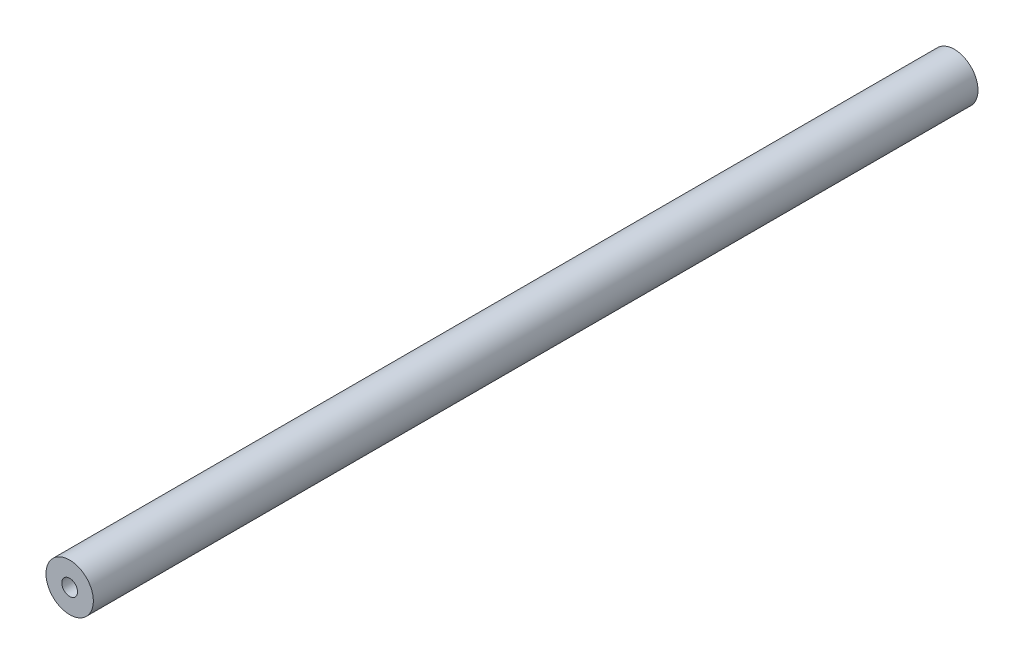
ISO-10303-21;
HEADER;
FILE_DESCRIPTION(('STEP AP214'),'2;1');
FILE_NAME('part.step','',(''),(''),'','','');
FILE_SCHEMA(('AUTOMOTIVE_DESIGN { 1 0 10303 214 1 1 1 1 }'));
ENDSEC;
DATA;
#1=APPLICATION_CONTEXT('core data for automotive mechanical design processes');
#2=APPLICATION_PROTOCOL_DEFINITION('international standard','automotive_design',2000,#1);
#3=PRODUCT_CONTEXT('',#1,'mechanical');
#4=PRODUCT('Part','Part','',(#3));
#5=PRODUCT_RELATED_PRODUCT_CATEGORY('part','',(#4));
#6=PRODUCT_DEFINITION_FORMATION('','',#4);
#7=PRODUCT_DEFINITION_CONTEXT('part definition',#1,'design');
#8=PRODUCT_DEFINITION('design','',#6,#7);
#9=PRODUCT_DEFINITION_SHAPE('','',#8);
#10=(LENGTH_UNIT() NAMED_UNIT(*) SI_UNIT(.MILLI.,.METRE.));
#11=(NAMED_UNIT(*) PLANE_ANGLE_UNIT() SI_UNIT($,.RADIAN.));
#12=(NAMED_UNIT(*) SI_UNIT($,.STERADIAN.) SOLID_ANGLE_UNIT());
#13=UNCERTAINTY_MEASURE_WITH_UNIT(LENGTH_MEASURE(1.E-05),#10,'distance_accuracy_value','');
#14=(GEOMETRIC_REPRESENTATION_CONTEXT(3) GLOBAL_UNCERTAINTY_ASSIGNED_CONTEXT((#13)) GLOBAL_UNIT_ASSIGNED_CONTEXT((#10,
#11,#12)) REPRESENTATION_CONTEXT('',''));
#15=CARTESIAN_POINT('',(0.,0.,0.));
#16=DIRECTION('',(0.,0.,1.));
#17=DIRECTION('',(1.,0.,0.));
#18=AXIS2_PLACEMENT_3D('',#15,#16,#17);
#19=CARTESIAN_POINT('',(0.,0.,140.));
#20=DIRECTION('',(0.,0.,-1.));
#21=DIRECTION('',(-1.,0.,0.));
#22=AXIS2_PLACEMENT_3D('',#19,#20,#21);
#23=CYLINDRICAL_SURFACE('',#22,7.5);
#24=CARTESIAN_POINT('',(0.,0.,140.));
#25=DIRECTION('',(0.,0.,1.));
#26=DIRECTION('',(1.,0.,0.));
#27=AXIS2_PLACEMENT_3D('',#24,#25,#26);
#28=CIRCLE('',#27,7.5);
#29=CARTESIAN_POINT('',(7.5,0.,140.));
#30=VERTEX_POINT('',#29);
#31=EDGE_CURVE('E11',#30,#30,#28,.T.);
#32=ORIENTED_EDGE('',*,*,#31,.F.);
#33=EDGE_LOOP('',(#32));
#34=FACE_BOUND('',#33,.T.);
#35=CARTESIAN_POINT('',(0.,0.,-140.));
#36=DIRECTION('',(0.,0.,1.));
#37=DIRECTION('',(1.,0.,0.));
#38=AXIS2_PLACEMENT_3D('',#35,#36,#37);
#39=CIRCLE('',#38,7.5);
#40=CARTESIAN_POINT('',(7.5,0.,-140.));
#41=VERTEX_POINT('',#40);
#42=EDGE_CURVE('E19',#41,#41,#39,.T.);
#43=ORIENTED_EDGE('',*,*,#42,.T.);
#44=EDGE_LOOP('',(#43));
#45=FACE_BOUND('',#44,.T.);
#46=ADVANCED_FACE('F16',(#34,#45),#23,.T.);
#47=CARTESIAN_POINT('',(0.,0.,140.));
#48=DIRECTION('',(0.,0.,1.));
#49=DIRECTION('',(1.,0.,0.));
#50=AXIS2_PLACEMENT_3D('',#47,#48,#49);
#51=PLANE('',#50);
#52=CARTESIAN_POINT('',(0.,0.,140.));
#53=DIRECTION('',(0.,0.,1.));
#54=DIRECTION('',(1.,0.,0.));
#55=AXIS2_PLACEMENT_3D('',#52,#53,#54);
#56=CIRCLE('',#55,2.5);
#57=CARTESIAN_POINT('',(2.5,0.,140.));
#58=VERTEX_POINT('',#57);
#59=EDGE_CURVE('E39',#58,#58,#56,.T.);
#60=ORIENTED_EDGE('',*,*,#59,.F.);
#61=EDGE_LOOP('',(#60));
#62=FACE_BOUND('',#61,.T.);
#63=ORIENTED_EDGE('',*,*,#31,.T.);
#64=EDGE_LOOP('',(#63));
#65=FACE_BOUND('',#64,.T.);
#66=ADVANCED_FACE('F58',(#62,#65),#51,.T.);
#67=CARTESIAN_POINT('',(0.,0.,-140.));
#68=DIRECTION('',(0.,0.,1.));
#69=DIRECTION('',(1.,0.,0.));
#70=AXIS2_PLACEMENT_3D('',#67,#68,#69);
#71=PLANE('',#70);
#72=CARTESIAN_POINT('',(0.,0.,-140.));
#73=DIRECTION('',(0.,0.,-1.));
#74=DIRECTION('',(-1.,0.,0.));
#75=AXIS2_PLACEMENT_3D('',#72,#73,#74);
#76=CIRCLE('',#75,2.5);
#77=CARTESIAN_POINT('',(-2.5,0.,-140.));
#78=VERTEX_POINT('',#77);
#79=EDGE_CURVE('E40',#78,#78,#76,.T.);
#80=ORIENTED_EDGE('',*,*,#79,.F.);
#81=EDGE_LOOP('',(#80));
#82=FACE_BOUND('',#81,.T.);
#83=ORIENTED_EDGE('',*,*,#42,.F.);
#84=EDGE_LOOP('',(#83));
#85=FACE_BOUND('',#84,.T.);
#86=ADVANCED_FACE('F55',(#82,#85),#71,.F.);
#87=CARTESIAN_POINT('',(0.,0.,125.));
#88=DIRECTION('',(0.,0.,1.));
#89=DIRECTION('',(1.,0.,0.));
#90=AXIS2_PLACEMENT_3D('',#87,#88,#89);
#91=CONICAL_SURFACE('',#90,2.5,1.02974425867666);
#92=CARTESIAN_POINT('',(0.,0.,123.497848452431));
#93=VERTEX_POINT('',#92);
#94=VERTEX_LOOP('',#93);
#95=FACE_BOUND('',#94,.T.);
#96=CARTESIAN_POINT('',(0.,0.,125.));
#97=DIRECTION('',(0.,0.,1.));
#98=DIRECTION('',(1.,0.,0.));
#99=AXIS2_PLACEMENT_3D('',#96,#97,#98);
#100=CIRCLE('',#99,2.5);
#101=CARTESIAN_POINT('',(2.5,0.,125.));
#102=VERTEX_POINT('',#101);
#103=EDGE_CURVE('E43',#102,#102,#100,.T.);
#104=ORIENTED_EDGE('',*,*,#103,.T.);
#105=EDGE_LOOP('',(#104));
#106=FACE_BOUND('',#105,.T.);
#107=ADVANCED_FACE('F57',(#95,#106),#91,.F.);
#108=CARTESIAN_POINT('',(0.,0.,140.));
#109=DIRECTION('',(0.,0.,1.));
#110=DIRECTION('',(1.,0.,0.));
#111=AXIS2_PLACEMENT_3D('',#108,#109,#110);
#112=CYLINDRICAL_SURFACE('',#111,2.5);
#113=ORIENTED_EDGE('',*,*,#103,.F.);
#114=EDGE_LOOP('',(#113));
#115=FACE_BOUND('',#114,.T.);
#116=ORIENTED_EDGE('',*,*,#59,.T.);
#117=EDGE_LOOP('',(#116));
#118=FACE_BOUND('',#117,.T.);
#119=ADVANCED_FACE('F33',(#115,#118),#112,.F.);
#120=CARTESIAN_POINT('',(0.,0.,-125.));
#121=DIRECTION('',(0.,0.,-1.));
#122=DIRECTION('',(-1.,0.,0.));
#123=AXIS2_PLACEMENT_3D('',#120,#121,#122);
#124=CONICAL_SURFACE('',#123,2.5,1.02974425867666);
#125=CARTESIAN_POINT('',(0.,0.,-123.497848452431));
#126=VERTEX_POINT('',#125);
#127=VERTEX_LOOP('',#126);
#128=FACE_BOUND('',#127,.T.);
#129=CARTESIAN_POINT('',(0.,0.,-125.));
#130=DIRECTION('',(0.,0.,-1.));
#131=DIRECTION('',(-1.,0.,0.));
#132=AXIS2_PLACEMENT_3D('',#129,#130,#131);
#133=CIRCLE('',#132,2.5);
#134=CARTESIAN_POINT('',(-2.5,0.,-125.));
#135=VERTEX_POINT('',#134);
#136=EDGE_CURVE('E37',#135,#135,#133,.T.);
#137=ORIENTED_EDGE('',*,*,#136,.T.);
#138=EDGE_LOOP('',(#137));
#139=FACE_BOUND('',#138,.T.);
#140=ADVANCED_FACE('F29',(#128,#139),#124,.F.);
#141=CARTESIAN_POINT('',(0.,0.,-140.));
#142=DIRECTION('',(0.,0.,-1.));
#143=DIRECTION('',(-1.,0.,0.));
#144=AXIS2_PLACEMENT_3D('',#141,#142,#143);
#145=CYLINDRICAL_SURFACE('',#144,2.5);
#146=ORIENTED_EDGE('',*,*,#136,.F.);
#147=EDGE_LOOP('',(#146));
#148=FACE_BOUND('',#147,.T.);
#149=ORIENTED_EDGE('',*,*,#79,.T.);
#150=EDGE_LOOP('',(#149));
#151=FACE_BOUND('',#150,.T.);
#152=ADVANCED_FACE('F32',(#148,#151),#145,.F.);
#153=CLOSED_SHELL('',(#46,#66,#86,#107,#119,#140,#152));
#154=MANIFOLD_SOLID_BREP('B1',#153);
#155=ADVANCED_BREP_SHAPE_REPRESENTATION('',(#18,#154),#14);
#156=SHAPE_DEFINITION_REPRESENTATION(#9,#155);
ENDSEC;
END-ISO-10303-21;
